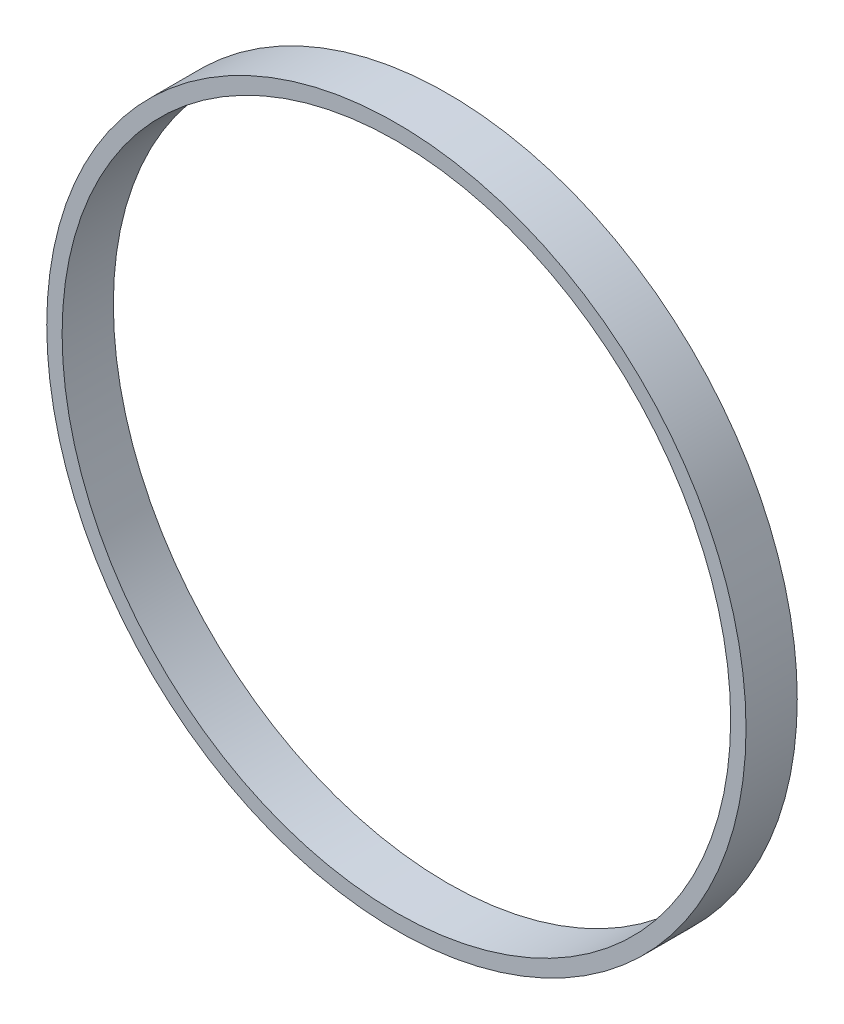
ISO-10303-21;
HEADER;
FILE_DESCRIPTION(('STEP AP214'),'2;1');
FILE_NAME('part.step','',(''),(''),'','','');
FILE_SCHEMA(('AUTOMOTIVE_DESIGN { 1 0 10303 214 1 1 1 1 }'));
ENDSEC;
DATA;
#1=APPLICATION_CONTEXT('core data for automotive mechanical design processes');
#2=APPLICATION_PROTOCOL_DEFINITION('international standard','automotive_design',2000,#1);
#3=PRODUCT_CONTEXT('',#1,'mechanical');
#4=PRODUCT('Part','Part','',(#3));
#5=PRODUCT_RELATED_PRODUCT_CATEGORY('part','',(#4));
#6=PRODUCT_DEFINITION_FORMATION('','',#4);
#7=PRODUCT_DEFINITION_CONTEXT('part definition',#1,'design');
#8=PRODUCT_DEFINITION('design','',#6,#7);
#9=PRODUCT_DEFINITION_SHAPE('','',#8);
#10=(LENGTH_UNIT() NAMED_UNIT(*) SI_UNIT(.MILLI.,.METRE.));
#11=(NAMED_UNIT(*) PLANE_ANGLE_UNIT() SI_UNIT($,.RADIAN.));
#12=(NAMED_UNIT(*) SI_UNIT($,.STERADIAN.) SOLID_ANGLE_UNIT());
#13=UNCERTAINTY_MEASURE_WITH_UNIT(LENGTH_MEASURE(1.E-05),#10,'distance_accuracy_value','');
#14=(GEOMETRIC_REPRESENTATION_CONTEXT(3) GLOBAL_UNCERTAINTY_ASSIGNED_CONTEXT((#13)) GLOBAL_UNIT_ASSIGNED_CONTEXT((#10,
#11,#12)) REPRESENTATION_CONTEXT('',''));
#15=CARTESIAN_POINT('',(0.,0.,0.));
#16=DIRECTION('',(0.,0.,1.));
#17=DIRECTION('',(1.,0.,0.));
#18=AXIS2_PLACEMENT_3D('',#15,#16,#17);
#19=CARTESIAN_POINT('',(0.,0.,6.));
#20=DIRECTION('',(0.,0.,1.));
#21=DIRECTION('',(1.,0.,0.));
#22=AXIS2_PLACEMENT_3D('',#19,#20,#21);
#23=PLANE('',#22);
#24=CARTESIAN_POINT('',(0.,0.,6.));
#25=DIRECTION('',(0.,0.,1.));
#26=DIRECTION('',(1.,0.,0.));
#27=AXIS2_PLACEMENT_3D('',#24,#25,#26);
#28=CIRCLE('',#27,40.95);
#29=CARTESIAN_POINT('',(40.95,0.,6.));
#30=VERTEX_POINT('',#29);
#31=EDGE_CURVE('E10',#30,#30,#28,.T.);
#32=ORIENTED_EDGE('',*,*,#31,.T.);
#33=EDGE_LOOP('',(#32));
#34=FACE_BOUND('',#33,.T.);
#35=CARTESIAN_POINT('',(0.,0.,6.));
#36=DIRECTION('',(0.,0.,1.));
#37=DIRECTION('',(1.,0.,0.));
#38=AXIS2_PLACEMENT_3D('',#35,#36,#37);
#39=CIRCLE('',#38,39.15);
#40=CARTESIAN_POINT('',(39.15,0.,6.));
#41=VERTEX_POINT('',#40);
#42=EDGE_CURVE('E50',#41,#41,#39,.T.);
#43=ORIENTED_EDGE('',*,*,#42,.F.);
#44=EDGE_LOOP('',(#43));
#45=FACE_BOUND('',#44,.T.);
#46=ADVANCED_FACE('F37',(#34,#45),#23,.T.);
#47=CARTESIAN_POINT('',(0.,0.,0.));
#48=DIRECTION('',(0.,0.,1.));
#49=DIRECTION('',(1.,0.,0.));
#50=AXIS2_PLACEMENT_3D('',#47,#48,#49);
#51=PLANE('',#50);
#52=CARTESIAN_POINT('',(0.,0.,0.));
#53=DIRECTION('',(0.,0.,1.));
#54=DIRECTION('',(1.,0.,0.));
#55=AXIS2_PLACEMENT_3D('',#52,#53,#54);
#56=CIRCLE('',#55,40.95);
#57=CARTESIAN_POINT('',(40.95,0.,0.));
#58=VERTEX_POINT('',#57);
#59=EDGE_CURVE('E41',#58,#58,#56,.T.);
#60=ORIENTED_EDGE('',*,*,#59,.F.);
#61=EDGE_LOOP('',(#60));
#62=FACE_BOUND('',#61,.T.);
#63=CARTESIAN_POINT('',(0.,0.,0.));
#64=DIRECTION('',(0.,0.,1.));
#65=DIRECTION('',(1.,0.,0.));
#66=AXIS2_PLACEMENT_3D('',#63,#64,#65);
#67=CIRCLE('',#66,39.15);
#68=CARTESIAN_POINT('',(39.15,0.,0.));
#69=VERTEX_POINT('',#68);
#70=EDGE_CURVE('E52',#69,#69,#67,.T.);
#71=ORIENTED_EDGE('',*,*,#70,.T.);
#72=EDGE_LOOP('',(#71));
#73=FACE_BOUND('',#72,.T.);
#74=ADVANCED_FACE('F64',(#62,#73),#51,.F.);
#75=CARTESIAN_POINT('',(0.,0.,6.));
#76=DIRECTION('',(0.,0.,-1.));
#77=DIRECTION('',(-1.,0.,0.));
#78=AXIS2_PLACEMENT_3D('',#75,#76,#77);
#79=CYLINDRICAL_SURFACE('',#78,40.95);
#80=ORIENTED_EDGE('',*,*,#31,.F.);
#81=EDGE_LOOP('',(#80));
#82=FACE_BOUND('',#81,.T.);
#83=ORIENTED_EDGE('',*,*,#59,.T.);
#84=EDGE_LOOP('',(#83));
#85=FACE_BOUND('',#84,.T.);
#86=ADVANCED_FACE('F39',(#82,#85),#79,.T.);
#87=CARTESIAN_POINT('',(0.,0.,6.));
#88=DIRECTION('',(0.,0.,-1.));
#89=DIRECTION('',(-1.,0.,0.));
#90=AXIS2_PLACEMENT_3D('',#87,#88,#89);
#91=CYLINDRICAL_SURFACE('',#90,39.15);
#92=ORIENTED_EDGE('',*,*,#42,.T.);
#93=EDGE_LOOP('',(#92));
#94=FACE_BOUND('',#93,.T.);
#95=ORIENTED_EDGE('',*,*,#70,.F.);
#96=EDGE_LOOP('',(#95));
#97=FACE_BOUND('',#96,.T.);
#98=ADVANCED_FACE('F60',(#94,#97),#91,.F.);
#99=CLOSED_SHELL('',(#46,#74,#86,#98));
#100=MANIFOLD_SOLID_BREP('B2',#99);
#101=ADVANCED_BREP_SHAPE_REPRESENTATION('',(#18,#100),#14);
#102=SHAPE_DEFINITION_REPRESENTATION(#9,#101);
ENDSEC;
END-ISO-10303-21;
